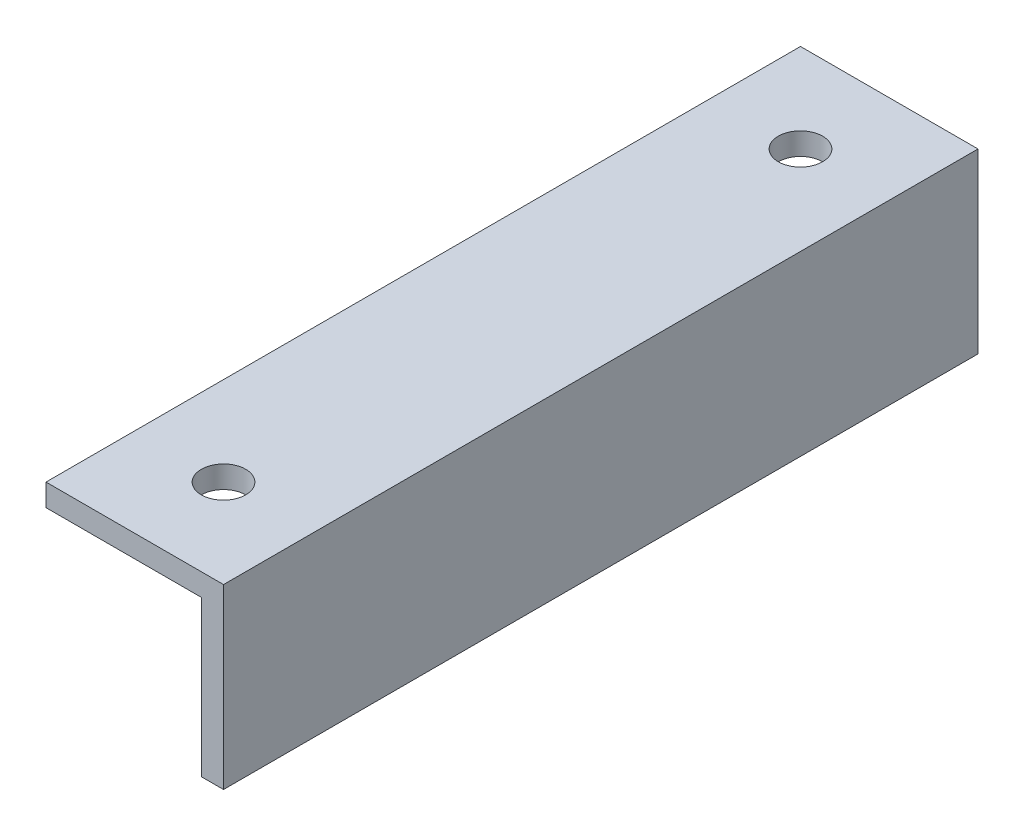
ISO-10303-21;
HEADER;
FILE_DESCRIPTION(('STEP AP214'),'2;1');
FILE_NAME('part.step','',(''),(''),'','','');
FILE_SCHEMA(('AUTOMOTIVE_DESIGN { 1 0 10303 214 1 1 1 1 }'));
ENDSEC;
DATA;
#1=APPLICATION_CONTEXT('core data for automotive mechanical design processes');
#2=APPLICATION_PROTOCOL_DEFINITION('international standard','automotive_design',2000,#1);
#3=PRODUCT_CONTEXT('',#1,'mechanical');
#4=PRODUCT('Part','Part','',(#3));
#5=PRODUCT_RELATED_PRODUCT_CATEGORY('part','',(#4));
#6=PRODUCT_DEFINITION_FORMATION('','',#4);
#7=PRODUCT_DEFINITION_CONTEXT('part definition',#1,'design');
#8=PRODUCT_DEFINITION('design','',#6,#7);
#9=PRODUCT_DEFINITION_SHAPE('','',#8);
#10=(LENGTH_UNIT() NAMED_UNIT(*) SI_UNIT(.MILLI.,.METRE.));
#11=(NAMED_UNIT(*) PLANE_ANGLE_UNIT() SI_UNIT($,.RADIAN.));
#12=(NAMED_UNIT(*) SI_UNIT($,.STERADIAN.) SOLID_ANGLE_UNIT());
#13=UNCERTAINTY_MEASURE_WITH_UNIT(LENGTH_MEASURE(1.E-05),#10,'distance_accuracy_value','');
#14=(GEOMETRIC_REPRESENTATION_CONTEXT(3) GLOBAL_UNCERTAINTY_ASSIGNED_CONTEXT((#13)) GLOBAL_UNIT_ASSIGNED_CONTEXT((#10,
#11,#12)) REPRESENTATION_CONTEXT('',''));
#15=CARTESIAN_POINT('',(0.,0.,0.));
#16=DIRECTION('',(0.,0.,1.));
#17=DIRECTION('',(1.,0.,0.));
#18=AXIS2_PLACEMENT_3D('',#15,#16,#17);
#19=CARTESIAN_POINT('',(0.,0.,107.95));
#20=DIRECTION('',(1.,0.,0.));
#21=DIRECTION('',(0.,0.,-1.));
#22=AXIS2_PLACEMENT_3D('',#19,#20,#21);
#23=PLANE('',#22);
#24=DIRECTION('',(0.,-1.,0.));
#25=VECTOR('',#24,1.);
#26=CARTESIAN_POINT('',(0.,0.,0.));
#27=LINE('',#26,#25);
#28=CARTESIAN_POINT('',(0.,0.,0.));
#29=VERTEX_POINT('',#28);
#30=CARTESIAN_POINT('',(0.,-3.175,0.));
#31=VERTEX_POINT('',#30);
#32=EDGE_CURVE('E115',#29,#31,#27,.T.);
#33=ORIENTED_EDGE('',*,*,#32,.T.);
#34=DIRECTION('',(0.,0.,-1.));
#35=VECTOR('',#34,1.);
#36=CARTESIAN_POINT('',(0.,-3.175,107.95));
#37=LINE('',#36,#35);
#38=CARTESIAN_POINT('',(0.,-3.175,107.95));
#39=VERTEX_POINT('',#38);
#40=EDGE_CURVE('E11',#39,#31,#37,.T.);
#41=ORIENTED_EDGE('',*,*,#40,.F.);
#42=DIRECTION('',(0.,-1.,0.));
#43=VECTOR('',#42,1.);
#44=CARTESIAN_POINT('',(0.,0.,107.95));
#45=LINE('',#44,#43);
#46=CARTESIAN_POINT('',(0.,0.,107.95));
#47=VERTEX_POINT('',#46);
#48=EDGE_CURVE('E80',#47,#39,#45,.T.);
#49=ORIENTED_EDGE('',*,*,#48,.F.);
#50=DIRECTION('',(0.,0.,-1.));
#51=VECTOR('',#50,1.);
#52=CARTESIAN_POINT('',(0.,0.,107.95));
#53=LINE('',#52,#51);
#54=EDGE_CURVE('E49',#47,#29,#53,.T.);
#55=ORIENTED_EDGE('',*,*,#54,.T.);
#56=EDGE_LOOP('',(#33,#41,#49,#55));
#57=FACE_BOUND('',#56,.T.);
#58=ADVANCED_FACE('F33',(#57),#23,.F.);
#59=CARTESIAN_POINT('',(22.225,-3.175,107.95));
#60=DIRECTION('',(0.,-1.,0.));
#61=DIRECTION('',(0.,0.,-1.));
#62=AXIS2_PLACEMENT_3D('',#59,#60,#61);
#63=PLANE('',#62);
#64=CARTESIAN_POINT('',(12.7,-3.175,95.25));
#65=DIRECTION('',(0.,-1.,0.));
#66=DIRECTION('',(0.,0.,-1.));
#67=AXIS2_PLACEMENT_3D('',#64,#65,#66);
#68=CIRCLE('',#67,3.17499999999999);
#69=CARTESIAN_POINT('',(12.7,-3.175,92.075));
#70=VERTEX_POINT('',#69);
#71=EDGE_CURVE('E166',#70,#70,#68,.T.);
#72=ORIENTED_EDGE('',*,*,#71,.F.);
#73=EDGE_LOOP('',(#72));
#74=FACE_BOUND('',#73,.T.);
#75=CARTESIAN_POINT('',(12.7,-3.175,12.7));
#76=DIRECTION('',(0.,-1.,0.));
#77=DIRECTION('',(0.,0.,-1.));
#78=AXIS2_PLACEMENT_3D('',#75,#76,#77);
#79=CIRCLE('',#78,3.175);
#80=CARTESIAN_POINT('',(12.7,-3.175,9.525));
#81=VERTEX_POINT('',#80);
#82=EDGE_CURVE('E118',#81,#81,#79,.T.);
#83=ORIENTED_EDGE('',*,*,#82,.F.);
#84=EDGE_LOOP('',(#83));
#85=FACE_BOUND('',#84,.T.);
#86=DIRECTION('',(-1.,0.,0.));
#87=VECTOR('',#86,1.);
#88=CARTESIAN_POINT('',(22.225,-3.175,0.));
#89=LINE('',#88,#87);
#90=CARTESIAN_POINT('',(22.225,-3.175,0.));
#91=VERTEX_POINT('',#90);
#92=EDGE_CURVE('E117',#91,#31,#89,.T.);
#93=ORIENTED_EDGE('',*,*,#92,.F.);
#94=DIRECTION('',(0.,0.,-1.));
#95=VECTOR('',#94,1.);
#96=CARTESIAN_POINT('',(22.225,-3.175,107.95));
#97=LINE('',#96,#95);
#98=CARTESIAN_POINT('',(22.225,-3.175,107.95));
#99=VERTEX_POINT('',#98);
#100=EDGE_CURVE('E41',#99,#91,#97,.T.);
#101=ORIENTED_EDGE('',*,*,#100,.F.);
#102=DIRECTION('',(-1.,0.,0.));
#103=VECTOR('',#102,1.);
#104=CARTESIAN_POINT('',(22.225,-3.175,107.95));
#105=LINE('',#104,#103);
#106=EDGE_CURVE('E159',#99,#39,#105,.T.);
#107=ORIENTED_EDGE('',*,*,#106,.T.);
#108=ORIENTED_EDGE('',*,*,#40,.T.);
#109=EDGE_LOOP('',(#93,#101,#107,#108));
#110=FACE_BOUND('',#109,.T.);
#111=ADVANCED_FACE('F138',(#74,#85,#110),#63,.T.);
#112=CARTESIAN_POINT('',(22.225,-25.4,107.95));
#113=DIRECTION('',(-1.,0.,0.));
#114=DIRECTION('',(0.,0.,1.));
#115=AXIS2_PLACEMENT_3D('',#112,#113,#114);
#116=PLANE('',#115);
#117=DIRECTION('',(0.,1.,0.));
#118=VECTOR('',#117,1.);
#119=CARTESIAN_POINT('',(22.225,-25.4,0.));
#120=LINE('',#119,#118);
#121=CARTESIAN_POINT('',(22.225,-25.4,0.));
#122=VERTEX_POINT('',#121);
#123=EDGE_CURVE('E121',#122,#91,#120,.T.);
#124=ORIENTED_EDGE('',*,*,#123,.F.);
#125=DIRECTION('',(0.,0.,-1.));
#126=VECTOR('',#125,1.);
#127=CARTESIAN_POINT('',(22.225,-25.4,107.95));
#128=LINE('',#127,#126);
#129=CARTESIAN_POINT('',(22.225,-25.4,107.95));
#130=VERTEX_POINT('',#129);
#131=EDGE_CURVE('E100',#130,#122,#128,.T.);
#132=ORIENTED_EDGE('',*,*,#131,.F.);
#133=DIRECTION('',(0.,1.,0.));
#134=VECTOR('',#133,1.);
#135=CARTESIAN_POINT('',(22.225,-25.4,107.95));
#136=LINE('',#135,#134);
#137=EDGE_CURVE('E107',#130,#99,#136,.T.);
#138=ORIENTED_EDGE('',*,*,#137,.T.);
#139=ORIENTED_EDGE('',*,*,#100,.T.);
#140=EDGE_LOOP('',(#124,#132,#138,#139));
#141=FACE_BOUND('',#140,.T.);
#142=ADVANCED_FACE('F135',(#141),#116,.T.);
#143=CARTESIAN_POINT('',(25.4,-25.4,107.95));
#144=DIRECTION('',(0.,-1.,0.));
#145=DIRECTION('',(0.,0.,-1.));
#146=AXIS2_PLACEMENT_3D('',#143,#144,#145);
#147=PLANE('',#146);
#148=DIRECTION('',(-1.,0.,0.));
#149=VECTOR('',#148,1.);
#150=CARTESIAN_POINT('',(25.4,-25.4,0.));
#151=LINE('',#150,#149);
#152=CARTESIAN_POINT('',(25.4,-25.4,0.));
#153=VERTEX_POINT('',#152);
#154=EDGE_CURVE('E96',#153,#122,#151,.T.);
#155=ORIENTED_EDGE('',*,*,#154,.F.);
#156=DIRECTION('',(0.,0.,-1.));
#157=VECTOR('',#156,1.);
#158=CARTESIAN_POINT('',(25.4,-25.4,107.95));
#159=LINE('',#158,#157);
#160=CARTESIAN_POINT('',(25.4,-25.4,107.95));
#161=VERTEX_POINT('',#160);
#162=EDGE_CURVE('E91',#161,#153,#159,.T.);
#163=ORIENTED_EDGE('',*,*,#162,.F.);
#164=DIRECTION('',(-1.,0.,0.));
#165=VECTOR('',#164,1.);
#166=CARTESIAN_POINT('',(25.4,-25.4,107.95));
#167=LINE('',#166,#165);
#168=EDGE_CURVE('E94',#161,#130,#167,.T.);
#169=ORIENTED_EDGE('',*,*,#168,.T.);
#170=ORIENTED_EDGE('',*,*,#131,.T.);
#171=EDGE_LOOP('',(#155,#163,#169,#170));
#172=FACE_BOUND('',#171,.T.);
#173=ADVANCED_FACE('F93',(#172),#147,.T.);
#174=CARTESIAN_POINT('',(25.4,0.,107.95));
#175=DIRECTION('',(1.,0.,0.));
#176=DIRECTION('',(0.,0.,-1.));
#177=AXIS2_PLACEMENT_3D('',#174,#175,#176);
#178=PLANE('',#177);
#179=DIRECTION('',(0.,-1.,0.));
#180=VECTOR('',#179,1.);
#181=CARTESIAN_POINT('',(25.4,0.,0.));
#182=LINE('',#181,#180);
#183=CARTESIAN_POINT('',(25.4,0.,0.));
#184=VERTEX_POINT('',#183);
#185=EDGE_CURVE('E125',#184,#153,#182,.T.);
#186=ORIENTED_EDGE('',*,*,#185,.F.);
#187=DIRECTION('',(0.,0.,-1.));
#188=VECTOR('',#187,1.);
#189=CARTESIAN_POINT('',(25.4,0.,107.95));
#190=LINE('',#189,#188);
#191=CARTESIAN_POINT('',(25.4,0.,107.95));
#192=VERTEX_POINT('',#191);
#193=EDGE_CURVE('E68',#192,#184,#190,.T.);
#194=ORIENTED_EDGE('',*,*,#193,.F.);
#195=DIRECTION('',(0.,-1.,0.));
#196=VECTOR('',#195,1.);
#197=CARTESIAN_POINT('',(25.4,0.,107.95));
#198=LINE('',#197,#196);
#199=EDGE_CURVE('E105',#192,#161,#198,.T.);
#200=ORIENTED_EDGE('',*,*,#199,.T.);
#201=ORIENTED_EDGE('',*,*,#162,.T.);
#202=EDGE_LOOP('',(#186,#194,#200,#201));
#203=FACE_BOUND('',#202,.T.);
#204=ADVANCED_FACE('F109',(#203),#178,.T.);
#205=CARTESIAN_POINT('',(0.,0.,107.95));
#206=DIRECTION('',(0.,1.,0.));
#207=DIRECTION('',(0.,0.,1.));
#208=AXIS2_PLACEMENT_3D('',#205,#206,#207);
#209=PLANE('',#208);
#210=CARTESIAN_POINT('',(12.7,0.,95.25));
#211=DIRECTION('',(0.,1.,0.));
#212=DIRECTION('',(0.,0.,1.));
#213=AXIS2_PLACEMENT_3D('',#210,#211,#212);
#214=CIRCLE('',#213,3.17499999999999);
#215=CARTESIAN_POINT('',(12.7,0.,98.425));
#216=VERTEX_POINT('',#215);
#217=EDGE_CURVE('E169',#216,#216,#214,.F.);
#218=ORIENTED_EDGE('',*,*,#217,.T.);
#219=EDGE_LOOP('',(#218));
#220=FACE_BOUND('',#219,.T.);
#221=CARTESIAN_POINT('',(12.7,0.,12.7));
#222=DIRECTION('',(0.,1.,0.));
#223=DIRECTION('',(0.,0.,1.));
#224=AXIS2_PLACEMENT_3D('',#221,#222,#223);
#225=CIRCLE('',#224,3.175);
#226=CARTESIAN_POINT('',(12.7,0.,15.875));
#227=VERTEX_POINT('',#226);
#228=EDGE_CURVE('E163',#227,#227,#225,.F.);
#229=ORIENTED_EDGE('',*,*,#228,.T.);
#230=EDGE_LOOP('',(#229));
#231=FACE_BOUND('',#230,.T.);
#232=DIRECTION('',(1.,0.,0.));
#233=VECTOR('',#232,1.);
#234=CARTESIAN_POINT('',(0.,0.,0.));
#235=LINE('',#234,#233);
#236=EDGE_CURVE('E127',#29,#184,#235,.T.);
#237=ORIENTED_EDGE('',*,*,#236,.F.);
#238=ORIENTED_EDGE('',*,*,#54,.F.);
#239=DIRECTION('',(1.,0.,0.));
#240=VECTOR('',#239,1.);
#241=CARTESIAN_POINT('',(0.,0.,107.95));
#242=LINE('',#241,#240);
#243=EDGE_CURVE('E110',#47,#192,#242,.T.);
#244=ORIENTED_EDGE('',*,*,#243,.T.);
#245=ORIENTED_EDGE('',*,*,#193,.T.);
#246=EDGE_LOOP('',(#237,#238,#244,#245));
#247=FACE_BOUND('',#246,.T.);
#248=ADVANCED_FACE('F141',(#220,#231,#247),#209,.T.);
#249=CARTESIAN_POINT('',(0.,0.,107.95));
#250=DIRECTION('',(0.,0.,-1.));
#251=DIRECTION('',(-1.,0.,0.));
#252=AXIS2_PLACEMENT_3D('',#249,#250,#251);
#253=PLANE('',#252);
#254=ORIENTED_EDGE('',*,*,#48,.T.);
#255=ORIENTED_EDGE('',*,*,#106,.F.);
#256=ORIENTED_EDGE('',*,*,#137,.F.);
#257=ORIENTED_EDGE('',*,*,#168,.F.);
#258=ORIENTED_EDGE('',*,*,#199,.F.);
#259=ORIENTED_EDGE('',*,*,#243,.F.);
#260=EDGE_LOOP('',(#254,#255,#256,#257,#258,#259));
#261=FACE_BOUND('',#260,.T.);
#262=ADVANCED_FACE('F104',(#261),#253,.F.);
#263=CARTESIAN_POINT('',(0.,0.,0.));
#264=DIRECTION('',(0.,0.,-1.));
#265=DIRECTION('',(-1.,0.,0.));
#266=AXIS2_PLACEMENT_3D('',#263,#264,#265);
#267=PLANE('',#266);
#268=ORIENTED_EDGE('',*,*,#32,.F.);
#269=ORIENTED_EDGE('',*,*,#236,.T.);
#270=ORIENTED_EDGE('',*,*,#185,.T.);
#271=ORIENTED_EDGE('',*,*,#154,.T.);
#272=ORIENTED_EDGE('',*,*,#123,.T.);
#273=ORIENTED_EDGE('',*,*,#92,.T.);
#274=EDGE_LOOP('',(#268,#269,#270,#271,#272,#273));
#275=FACE_BOUND('',#274,.T.);
#276=ADVANCED_FACE('F140',(#275),#267,.T.);
#277=CARTESIAN_POINT('',(12.7,0.00100000000000013,12.7));
#278=DIRECTION('',(0.,-1.,0.));
#279=DIRECTION('',(0.,0.,-1.));
#280=AXIS2_PLACEMENT_3D('',#277,#278,#279);
#281=CYLINDRICAL_SURFACE('',#280,3.175);
#282=ORIENTED_EDGE('',*,*,#228,.F.);
#283=EDGE_LOOP('',(#282));
#284=FACE_BOUND('',#283,.T.);
#285=ORIENTED_EDGE('',*,*,#82,.T.);
#286=EDGE_LOOP('',(#285));
#287=FACE_BOUND('',#286,.T.);
#288=ADVANCED_FACE('F178',(#284,#287),#281,.F.);
#289=CARTESIAN_POINT('',(12.7,0.00100000000000013,95.25));
#290=DIRECTION('',(0.,-1.,0.));
#291=DIRECTION('',(0.,0.,-1.));
#292=AXIS2_PLACEMENT_3D('',#289,#290,#291);
#293=CYLINDRICAL_SURFACE('',#292,3.17499999999999);
#294=ORIENTED_EDGE('',*,*,#217,.F.);
#295=EDGE_LOOP('',(#294));
#296=FACE_BOUND('',#295,.T.);
#297=ORIENTED_EDGE('',*,*,#71,.T.);
#298=EDGE_LOOP('',(#297));
#299=FACE_BOUND('',#298,.T.);
#300=ADVANCED_FACE('F174',(#296,#299),#293,.F.);
#301=CLOSED_SHELL('',(#58,#111,#142,#173,#204,#248,#262,#276,#288,#300));
#302=MANIFOLD_SOLID_BREP('B2',#301);
#303=ADVANCED_BREP_SHAPE_REPRESENTATION('',(#18,#302),#14);
#304=SHAPE_DEFINITION_REPRESENTATION(#9,#303);
ENDSEC;
END-ISO-10303-21;
